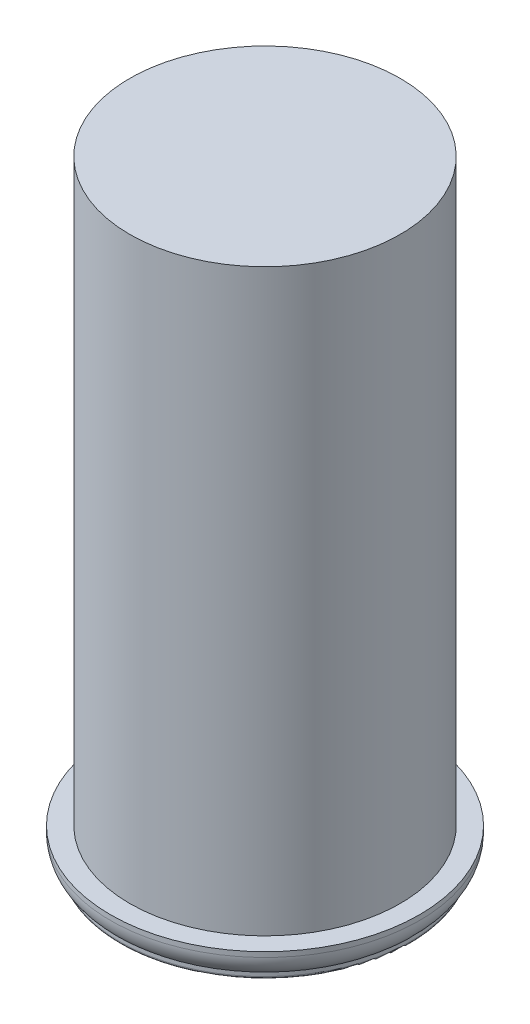
ISO-10303-21;
HEADER;
FILE_DESCRIPTION(('STEP AP214'),'2;1');
FILE_NAME('part.step','',(''),(''),'','','');
FILE_SCHEMA(('AUTOMOTIVE_DESIGN { 1 0 10303 214 1 1 1 1 }'));
ENDSEC;
DATA;
#1=APPLICATION_CONTEXT('core data for automotive mechanical design processes');
#2=APPLICATION_PROTOCOL_DEFINITION('international standard','automotive_design',2000,#1);
#3=PRODUCT_CONTEXT('',#1,'mechanical');
#4=PRODUCT('Part','Part','',(#3));
#5=PRODUCT_RELATED_PRODUCT_CATEGORY('part','',(#4));
#6=PRODUCT_DEFINITION_FORMATION('','',#4);
#7=PRODUCT_DEFINITION_CONTEXT('part definition',#1,'design');
#8=PRODUCT_DEFINITION('design','',#6,#7);
#9=PRODUCT_DEFINITION_SHAPE('','',#8);
#10=(LENGTH_UNIT() NAMED_UNIT(*) SI_UNIT(.MILLI.,.METRE.));
#11=(NAMED_UNIT(*) PLANE_ANGLE_UNIT() SI_UNIT($,.RADIAN.));
#12=(NAMED_UNIT(*) SI_UNIT($,.STERADIAN.) SOLID_ANGLE_UNIT());
#13=UNCERTAINTY_MEASURE_WITH_UNIT(LENGTH_MEASURE(1.E-05),#10,'distance_accuracy_value','');
#14=(GEOMETRIC_REPRESENTATION_CONTEXT(3) GLOBAL_UNCERTAINTY_ASSIGNED_CONTEXT((#13)) GLOBAL_UNIT_ASSIGNED_CONTEXT((#10,
#11,#12)) REPRESENTATION_CONTEXT('',''));
#15=CARTESIAN_POINT('',(0.,0.,0.));
#16=DIRECTION('',(0.,0.,1.));
#17=DIRECTION('',(1.,0.,0.));
#18=AXIS2_PLACEMENT_3D('',#15,#16,#17);
#19=CARTESIAN_POINT('',(0.,2.54,0.));
#20=DIRECTION('',(0.,1.,0.));
#21=DIRECTION('',(0.,0.,1.));
#22=AXIS2_PLACEMENT_3D('',#19,#20,#21);
#23=PLANE('',#22);
#24=CARTESIAN_POINT('',(0.,2.54,0.));
#25=DIRECTION('',(0.,1.,0.));
#26=DIRECTION('',(0.,0.,1.));
#27=AXIS2_PLACEMENT_3D('',#24,#25,#26);
#28=CIRCLE('',#27,16.);
#29=CARTESIAN_POINT('',(0.,2.54,16.));
#30=VERTEX_POINT('',#29);
#31=EDGE_CURVE('E50',#30,#30,#28,.T.);
#32=ORIENTED_EDGE('',*,*,#31,.T.);
#33=EDGE_LOOP('',(#32));
#34=FACE_BOUND('',#33,.T.);
#35=CARTESIAN_POINT('',(0.,2.54,0.));
#36=DIRECTION('',(0.,1.,0.));
#37=DIRECTION('',(0.,0.,1.));
#38=AXIS2_PLACEMENT_3D('',#35,#36,#37);
#39=CIRCLE('',#38,14.);
#40=CARTESIAN_POINT('',(0.,2.54,14.));
#41=VERTEX_POINT('',#40);
#42=EDGE_CURVE('E54',#41,#41,#39,.T.);
#43=ORIENTED_EDGE('',*,*,#42,.F.);
#44=EDGE_LOOP('',(#43));
#45=FACE_BOUND('',#44,.T.);
#46=ADVANCED_FACE('F30',(#34,#45),#23,.T.);
#47=CARTESIAN_POINT('',(0.,2.54,0.));
#48=DIRECTION('',(0.,-1.,0.));
#49=DIRECTION('',(0.,0.,-1.));
#50=AXIS2_PLACEMENT_3D('',#47,#48,#49);
#51=CYLINDRICAL_SURFACE('',#50,16.);
#52=CARTESIAN_POINT('',(0.,2.01990098767242,0.));
#53=DIRECTION('',(0.,-1.,0.));
#54=DIRECTION('',(0.,0.,-1.));
#55=AXIS2_PLACEMENT_3D('',#52,#53,#54);
#56=CIRCLE('',#55,16.);
#57=CARTESIAN_POINT('',(0.,2.01990098767242,-16.));
#58=VERTEX_POINT('',#57);
#59=EDGE_CURVE('E41',#58,#58,#56,.F.);
#60=ORIENTED_EDGE('',*,*,#59,.T.);
#61=EDGE_LOOP('',(#60));
#62=FACE_BOUND('',#61,.T.);
#63=ORIENTED_EDGE('',*,*,#31,.F.);
#64=EDGE_LOOP('',(#63));
#65=FACE_BOUND('',#64,.T.);
#66=ADVANCED_FACE('F65',(#62,#65),#51,.T.);
#67=CARTESIAN_POINT('',(0.,62.54,0.));
#68=DIRECTION('',(0.,-1.,0.));
#69=DIRECTION('',(0.,0.,-1.));
#70=AXIS2_PLACEMENT_3D('',#67,#68,#69);
#71=CYLINDRICAL_SURFACE('',#70,14.);
#72=CARTESIAN_POINT('',(0.,62.54,0.));
#73=DIRECTION('',(0.,1.,0.));
#74=DIRECTION('',(0.,0.,1.));
#75=AXIS2_PLACEMENT_3D('',#72,#73,#74);
#76=CIRCLE('',#75,14.);
#77=CARTESIAN_POINT('',(0.,62.54,14.));
#78=VERTEX_POINT('',#77);
#79=EDGE_CURVE('E53',#78,#78,#76,.T.);
#80=ORIENTED_EDGE('',*,*,#79,.F.);
#81=EDGE_LOOP('',(#80));
#82=FACE_BOUND('',#81,.T.);
#83=ORIENTED_EDGE('',*,*,#42,.T.);
#84=EDGE_LOOP('',(#83));
#85=FACE_BOUND('',#84,.T.);
#86=ADVANCED_FACE('F62',(#82,#85),#71,.T.);
#87=CARTESIAN_POINT('',(0.,62.54,0.));
#88=DIRECTION('',(0.,1.,0.));
#89=DIRECTION('',(0.,0.,1.));
#90=AXIS2_PLACEMENT_3D('',#87,#88,#89);
#91=PLANE('',#90);
#92=ORIENTED_EDGE('',*,*,#79,.T.);
#93=EDGE_LOOP('',(#92));
#94=FACE_BOUND('',#93,.T.);
#95=ADVANCED_FACE('F60',(#94),#91,.T.);
#96=CARTESIAN_POINT('',(0.,-2.54,0.));
#97=DIRECTION('',(0.,1.,0.));
#98=DIRECTION('',(0.,0.,1.));
#99=AXIS2_PLACEMENT_3D('',#96,#97,#98);
#100=CYLINDRICAL_SURFACE('',#99,15.);
#101=CARTESIAN_POINT('',(0.,-0.396686594184245,0.));
#102=DIRECTION('',(0.,-1.,0.));
#103=DIRECTION('',(0.,0.,-1.));
#104=AXIS2_PLACEMENT_3D('',#101,#102,#103);
#105=CIRCLE('',#104,15.);
#106=CARTESIAN_POINT('',(0.,-0.396686594184245,-15.));
#107=VERTEX_POINT('',#106);
#108=EDGE_CURVE('E10',#107,#107,#105,.F.);
#109=ORIENTED_EDGE('',*,*,#108,.T.);
#110=EDGE_LOOP('',(#109));
#111=FACE_BOUND('',#110,.T.);
#112=CARTESIAN_POINT('',(0.,0.,0.));
#113=DIRECTION('',(0.,1.,0.));
#114=DIRECTION('',(0.,0.,1.));
#115=AXIS2_PLACEMENT_3D('',#112,#113,#114);
#116=CIRCLE('',#115,15.);
#117=CARTESIAN_POINT('',(0.,0.,15.));
#118=VERTEX_POINT('',#117);
#119=EDGE_CURVE('E45',#118,#118,#116,.F.);
#120=ORIENTED_EDGE('',*,*,#119,.T.);
#121=EDGE_LOOP('',(#120));
#122=FACE_BOUND('',#121,.T.);
#123=ADVANCED_FACE('F82',(#111,#122),#100,.T.);
#124=CARTESIAN_POINT('',(0.,-5.04826771653543,0.));
#125=DIRECTION('',(0.,0.,1.));
#126=DIRECTION('',(1.,0.,0.));
#127=AXIS2_PLACEMENT_3D('',#124,#125,#126);
#128=SPHERICAL_SURFACE('',#127,15.2082677165354);
#129=CARTESIAN_POINT('',(0.,-5.04826771653543,0.));
#130=DIRECTION('',(0.,-1.,0.));
#131=DIRECTION('',(0.,0.,-1.));
#132=AXIS2_PLACEMENT_3D('',#129,#130,#131);
#133=SPHERICAL_SURFACE('',#132,15.2082677165354);
#134=CARTESIAN_POINT('',(0.,-0.473098516855439,0.));
#135=DIRECTION('',(0.,-1.,0.));
#136=DIRECTION('',(0.,0.,-1.));
#137=AXIS2_PLACEMENT_3D('',#134,#135,#136);
#138=CIRCLE('',#137,14.5037661913075);
#139=CARTESIAN_POINT('',(0.,-0.473098516855439,-14.5037661913075));
#140=VERTEX_POINT('',#139);
#141=EDGE_CURVE('E37',#140,#140,#138,.T.);
#142=ORIENTED_EDGE('',*,*,#141,.T.);
#143=EDGE_LOOP('',(#142));
#144=FACE_BOUND('',#143,.T.);
#145=ADVANCED_FACE('F79',(#144),#133,.F.);
#146=CARTESIAN_POINT('',(0.,2.01990098767242,0.));
#147=DIRECTION('',(0.,-1.,0.));
#148=DIRECTION('',(0.,0.,-1.));
#149=AXIS2_PLACEMENT_3D('',#146,#147,#148);
#150=TOROIDAL_SURFACE('',#149,13.46,2.54);
#151=ORIENTED_EDGE('',*,*,#119,.F.);
#152=EDGE_LOOP('',(#151));
#153=FACE_BOUND('',#152,.T.);
#154=ORIENTED_EDGE('',*,*,#59,.F.);
#155=EDGE_LOOP('',(#154));
#156=FACE_BOUND('',#155,.T.);
#157=ADVANCED_FACE('F81',(#153,#156),#150,.T.);
#158=CARTESIAN_POINT('',(0.,-0.396686594184245,0.));
#159=DIRECTION('',(0.,-1.,0.));
#160=DIRECTION('',(0.,0.,-1.));
#161=AXIS2_PLACEMENT_3D('',#158,#159,#160);
#162=TOROIDAL_SURFACE('',#161,14.746,0.254);
#163=ORIENTED_EDGE('',*,*,#108,.F.);
#164=EDGE_LOOP('',(#163));
#165=FACE_BOUND('',#164,.T.);
#166=ORIENTED_EDGE('',*,*,#141,.F.);
#167=EDGE_LOOP('',(#166));
#168=FACE_BOUND('',#167,.T.);
#169=ADVANCED_FACE('F32',(#165,#168),#162,.T.);
#170=CLOSED_SHELL('',(#46,#66,#86,#95,#123,#145,#157,#169));
#171=MANIFOLD_SOLID_BREP('B2',#170);
#172=ADVANCED_BREP_SHAPE_REPRESENTATION('',(#18,#171),#14);
#173=SHAPE_DEFINITION_REPRESENTATION(#9,#172);
ENDSEC;
END-ISO-10303-21;
